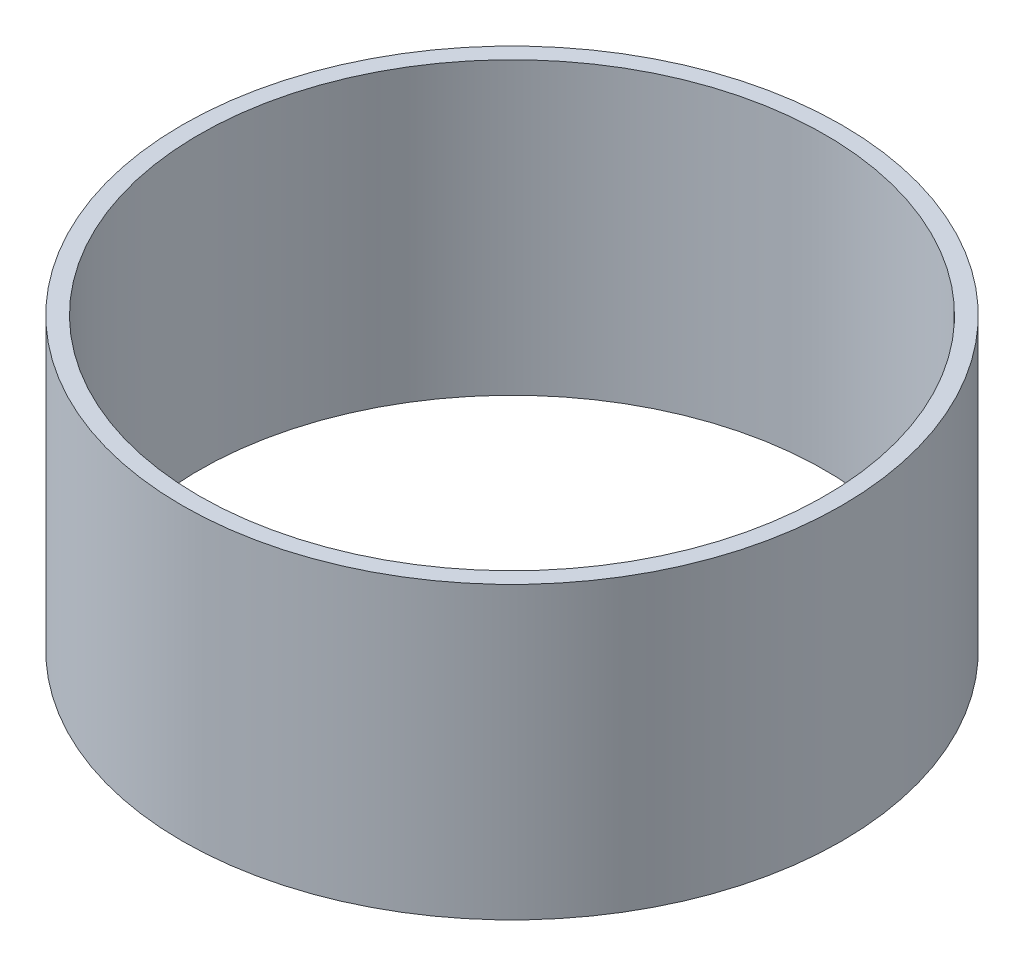
ISO-10303-21;
HEADER;
FILE_DESCRIPTION(('STEP AP214'),'2;1');
FILE_NAME('part.step','',(''),(''),'','','');
FILE_SCHEMA(('AUTOMOTIVE_DESIGN { 1 0 10303 214 1 1 1 1 }'));
ENDSEC;
DATA;
#1=APPLICATION_CONTEXT('core data for automotive mechanical design processes');
#2=APPLICATION_PROTOCOL_DEFINITION('international standard','automotive_design',2000,#1);
#3=PRODUCT_CONTEXT('',#1,'mechanical');
#4=PRODUCT('Part','Part','',(#3));
#5=PRODUCT_RELATED_PRODUCT_CATEGORY('part','',(#4));
#6=PRODUCT_DEFINITION_FORMATION('','',#4);
#7=PRODUCT_DEFINITION_CONTEXT('part definition',#1,'design');
#8=PRODUCT_DEFINITION('design','',#6,#7);
#9=PRODUCT_DEFINITION_SHAPE('','',#8);
#10=(LENGTH_UNIT() NAMED_UNIT(*) SI_UNIT(.MILLI.,.METRE.));
#11=(NAMED_UNIT(*) PLANE_ANGLE_UNIT() SI_UNIT($,.RADIAN.));
#12=(NAMED_UNIT(*) SI_UNIT($,.STERADIAN.) SOLID_ANGLE_UNIT());
#13=UNCERTAINTY_MEASURE_WITH_UNIT(LENGTH_MEASURE(1.E-05),#10,'distance_accuracy_value','');
#14=(GEOMETRIC_REPRESENTATION_CONTEXT(3) GLOBAL_UNCERTAINTY_ASSIGNED_CONTEXT((#13)) GLOBAL_UNIT_ASSIGNED_CONTEXT((#10,
#11,#12)) REPRESENTATION_CONTEXT('',''));
#15=CARTESIAN_POINT('',(0.,0.,0.));
#16=DIRECTION('',(0.,0.,1.));
#17=DIRECTION('',(1.,0.,0.));
#18=AXIS2_PLACEMENT_3D('',#15,#16,#17);
#19=CARTESIAN_POINT('',(0.,41.275,0.));
#20=DIRECTION('',(0.,1.,0.));
#21=DIRECTION('',(0.,0.,1.));
#22=AXIS2_PLACEMENT_3D('',#19,#20,#21);
#23=PLANE('',#22);
#24=CARTESIAN_POINT('',(0.,41.275,0.));
#25=DIRECTION('',(0.,1.,0.));
#26=DIRECTION('',(0.,0.,1.));
#27=AXIS2_PLACEMENT_3D('',#24,#25,#26);
#28=CIRCLE('',#27,93.6625);
#29=CARTESIAN_POINT('',(0.,41.275,93.6625));
#30=VERTEX_POINT('',#29);
#31=EDGE_CURVE('E10',#30,#30,#28,.T.);
#32=ORIENTED_EDGE('',*,*,#31,.T.);
#33=EDGE_LOOP('',(#32));
#34=FACE_BOUND('',#33,.T.);
#35=CARTESIAN_POINT('',(0.,41.275,0.));
#36=DIRECTION('',(0.,1.,0.));
#37=DIRECTION('',(0.,0.,1.));
#38=AXIS2_PLACEMENT_3D('',#35,#36,#37);
#39=CIRCLE('',#38,88.9);
#40=CARTESIAN_POINT('',(0.,41.275,88.9));
#41=VERTEX_POINT('',#40);
#42=EDGE_CURVE('E52',#41,#41,#39,.T.);
#43=ORIENTED_EDGE('',*,*,#42,.F.);
#44=EDGE_LOOP('',(#43));
#45=FACE_BOUND('',#44,.T.);
#46=ADVANCED_FACE('F41',(#34,#45),#23,.T.);
#47=CARTESIAN_POINT('',(0.,-41.275,0.));
#48=DIRECTION('',(0.,1.,0.));
#49=DIRECTION('',(0.,0.,1.));
#50=AXIS2_PLACEMENT_3D('',#47,#48,#49);
#51=PLANE('',#50);
#52=CARTESIAN_POINT('',(0.,-41.275,0.));
#53=DIRECTION('',(0.,1.,0.));
#54=DIRECTION('',(0.,0.,1.));
#55=AXIS2_PLACEMENT_3D('',#52,#53,#54);
#56=CIRCLE('',#55,93.6625);
#57=CARTESIAN_POINT('',(0.,-41.275,93.6625));
#58=VERTEX_POINT('',#57);
#59=EDGE_CURVE('E45',#58,#58,#56,.T.);
#60=ORIENTED_EDGE('',*,*,#59,.F.);
#61=EDGE_LOOP('',(#60));
#62=FACE_BOUND('',#61,.T.);
#63=CARTESIAN_POINT('',(0.,-41.275,0.));
#64=DIRECTION('',(0.,1.,0.));
#65=DIRECTION('',(0.,0.,1.));
#66=AXIS2_PLACEMENT_3D('',#63,#64,#65);
#67=CIRCLE('',#66,88.9);
#68=CARTESIAN_POINT('',(0.,-41.275,88.9));
#69=VERTEX_POINT('',#68);
#70=EDGE_CURVE('E54',#69,#69,#67,.T.);
#71=ORIENTED_EDGE('',*,*,#70,.T.);
#72=EDGE_LOOP('',(#71));
#73=FACE_BOUND('',#72,.T.);
#74=ADVANCED_FACE('F64',(#62,#73),#51,.F.);
#75=CARTESIAN_POINT('',(0.,41.275,0.));
#76=DIRECTION('',(0.,-1.,0.));
#77=DIRECTION('',(0.,0.,-1.));
#78=AXIS2_PLACEMENT_3D('',#75,#76,#77);
#79=CYLINDRICAL_SURFACE('',#78,93.6625);
#80=ORIENTED_EDGE('',*,*,#31,.F.);
#81=EDGE_LOOP('',(#80));
#82=FACE_BOUND('',#81,.T.);
#83=ORIENTED_EDGE('',*,*,#59,.T.);
#84=EDGE_LOOP('',(#83));
#85=FACE_BOUND('',#84,.T.);
#86=ADVANCED_FACE('F43',(#82,#85),#79,.T.);
#87=CARTESIAN_POINT('',(0.,41.275,0.));
#88=DIRECTION('',(0.,-1.,0.));
#89=DIRECTION('',(0.,0.,-1.));
#90=AXIS2_PLACEMENT_3D('',#87,#88,#89);
#91=CYLINDRICAL_SURFACE('',#90,88.9);
#92=ORIENTED_EDGE('',*,*,#42,.T.);
#93=EDGE_LOOP('',(#92));
#94=FACE_BOUND('',#93,.T.);
#95=ORIENTED_EDGE('',*,*,#70,.F.);
#96=EDGE_LOOP('',(#95));
#97=FACE_BOUND('',#96,.T.);
#98=ADVANCED_FACE('F60',(#94,#97),#91,.F.);
#99=CLOSED_SHELL('',(#46,#74,#86,#98));
#100=MANIFOLD_SOLID_BREP('B2',#99);
#101=ADVANCED_BREP_SHAPE_REPRESENTATION('',(#18,#100),#14);
#102=SHAPE_DEFINITION_REPRESENTATION(#9,#101);
ENDSEC;
END-ISO-10303-21;
